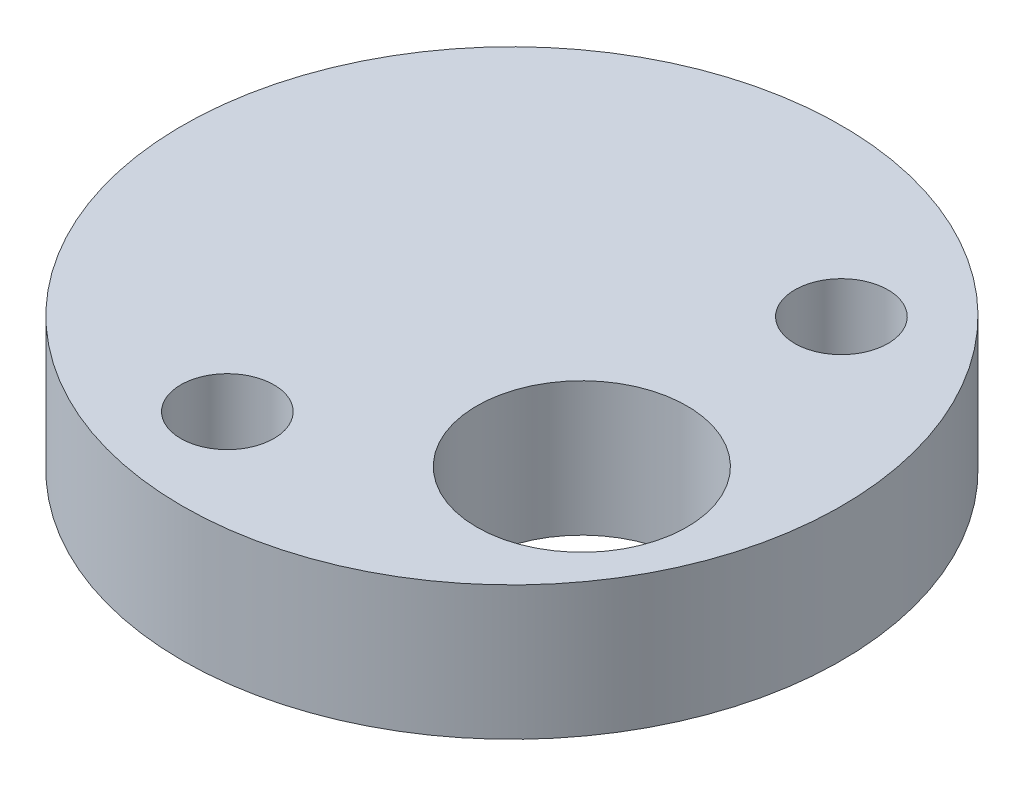
ISO-10303-21;
HEADER;
FILE_DESCRIPTION(('STEP AP214'),'2;1');
FILE_NAME('part.step','',(''),(''),'','','');
FILE_SCHEMA(('AUTOMOTIVE_DESIGN { 1 0 10303 214 1 1 1 1 }'));
ENDSEC;
DATA;
#1=APPLICATION_CONTEXT('core data for automotive mechanical design processes');
#2=APPLICATION_PROTOCOL_DEFINITION('international standard','automotive_design',2000,#1);
#3=PRODUCT_CONTEXT('',#1,'mechanical');
#4=PRODUCT('Part','Part','',(#3));
#5=PRODUCT_RELATED_PRODUCT_CATEGORY('part','',(#4));
#6=PRODUCT_DEFINITION_FORMATION('','',#4);
#7=PRODUCT_DEFINITION_CONTEXT('part definition',#1,'design');
#8=PRODUCT_DEFINITION('design','',#6,#7);
#9=PRODUCT_DEFINITION_SHAPE('','',#8);
#10=(LENGTH_UNIT() NAMED_UNIT(*) SI_UNIT(.MILLI.,.METRE.));
#11=(NAMED_UNIT(*) PLANE_ANGLE_UNIT() SI_UNIT($,.RADIAN.));
#12=(NAMED_UNIT(*) SI_UNIT($,.STERADIAN.) SOLID_ANGLE_UNIT());
#13=UNCERTAINTY_MEASURE_WITH_UNIT(LENGTH_MEASURE(1.E-05),#10,'distance_accuracy_value','');
#14=(GEOMETRIC_REPRESENTATION_CONTEXT(3) GLOBAL_UNCERTAINTY_ASSIGNED_CONTEXT((#13)) GLOBAL_UNIT_ASSIGNED_CONTEXT((#10,
#11,#12)) REPRESENTATION_CONTEXT('',''));
#15=CARTESIAN_POINT('',(0.,0.,0.));
#16=DIRECTION('',(0.,0.,1.));
#17=DIRECTION('',(1.,0.,0.));
#18=AXIS2_PLACEMENT_3D('',#15,#16,#17);
#19=CARTESIAN_POINT('',(-3.46410161513776,-5.6,-2.));
#20=DIRECTION('',(0.,1.,0.));
#21=DIRECTION('',(0.,0.,1.));
#22=AXIS2_PLACEMENT_3D('',#19,#20,#21);
#23=CYLINDRICAL_SURFACE('',#22,6.9);
#24=CARTESIAN_POINT('',(-3.46410161513776,-5.6,-2.));
#25=DIRECTION('',(0.,1.,0.));
#26=DIRECTION('',(0.,0.,1.));
#27=AXIS2_PLACEMENT_3D('',#24,#25,#26);
#28=CIRCLE('',#27,6.9);
#29=CARTESIAN_POINT('',(-3.46410161513776,-5.6,4.9));
#30=VERTEX_POINT('',#29);
#31=EDGE_CURVE('E10',#30,#30,#28,.T.);
#32=ORIENTED_EDGE('',*,*,#31,.T.);
#33=EDGE_LOOP('',(#32));
#34=FACE_BOUND('',#33,.T.);
#35=CARTESIAN_POINT('',(-3.46410161513776,-2.8,-2.));
#36=DIRECTION('',(0.,1.,0.));
#37=DIRECTION('',(0.,0.,1.));
#38=AXIS2_PLACEMENT_3D('',#35,#36,#37);
#39=CIRCLE('',#38,6.9);
#40=CARTESIAN_POINT('',(-3.46410161513776,-2.8,4.9));
#41=VERTEX_POINT('',#40);
#42=EDGE_CURVE('E42',#41,#41,#39,.T.);
#43=ORIENTED_EDGE('',*,*,#42,.F.);
#44=EDGE_LOOP('',(#43));
#45=FACE_BOUND('',#44,.T.);
#46=ADVANCED_FACE('F39',(#34,#45),#23,.T.);
#47=CARTESIAN_POINT('',(-3.46410161513776,-5.6,-2.));
#48=DIRECTION('',(0.,1.,0.));
#49=DIRECTION('',(0.,0.,1.));
#50=AXIS2_PLACEMENT_3D('',#47,#48,#49);
#51=PLANE('',#50);
#52=CARTESIAN_POINT('',(0.,-5.6,-5.43370574956714));
#53=DIRECTION('',(0.,1.,0.));
#54=DIRECTION('',(0.,0.,1.));
#55=AXIS2_PLACEMENT_3D('',#52,#53,#54);
#56=CIRCLE('',#55,0.975000000000001);
#57=CARTESIAN_POINT('',(0.,-5.6,-4.45870574956714));
#58=VERTEX_POINT('',#57);
#59=EDGE_CURVE('E60',#58,#58,#56,.T.);
#60=ORIENTED_EDGE('',*,*,#59,.T.);
#61=EDGE_LOOP('',(#60));
#62=FACE_BOUND('',#61,.T.);
#63=CARTESIAN_POINT('',(0.,-5.6,0.));
#64=DIRECTION('',(0.,1.,0.));
#65=DIRECTION('',(0.,0.,1.));
#66=AXIS2_PLACEMENT_3D('',#63,#64,#65);
#67=CIRCLE('',#66,2.2);
#68=CARTESIAN_POINT('',(0.,-5.6,2.2));
#69=VERTEX_POINT('',#68);
#70=EDGE_CURVE('E54',#69,#69,#67,.T.);
#71=ORIENTED_EDGE('',*,*,#70,.T.);
#72=EDGE_LOOP('',(#71));
#73=FACE_BOUND('',#72,.T.);
#74=CARTESIAN_POINT('',(-4.70572721581471,-5.6,2.71685287478357));
#75=DIRECTION('',(0.,1.,0.));
#76=DIRECTION('',(0.,0.,1.));
#77=AXIS2_PLACEMENT_3D('',#74,#75,#76);
#78=CIRCLE('',#77,0.975);
#79=CARTESIAN_POINT('',(-4.70572721581471,-5.6,3.69185287478357));
#80=VERTEX_POINT('',#79);
#81=EDGE_CURVE('E49',#80,#80,#78,.T.);
#82=ORIENTED_EDGE('',*,*,#81,.T.);
#83=EDGE_LOOP('',(#82));
#84=FACE_BOUND('',#83,.T.);
#85=ORIENTED_EDGE('',*,*,#31,.F.);
#86=EDGE_LOOP('',(#85));
#87=FACE_BOUND('',#86,.T.);
#88=ADVANCED_FACE('F69',(#62,#73,#84,#87),#51,.F.);
#89=CARTESIAN_POINT('',(-3.46410161513776,-2.8,-2.));
#90=DIRECTION('',(0.,1.,0.));
#91=DIRECTION('',(0.,0.,1.));
#92=AXIS2_PLACEMENT_3D('',#89,#90,#91);
#93=PLANE('',#92);
#94=CARTESIAN_POINT('',(0.,-2.8,-5.43370574956714));
#95=DIRECTION('',(0.,1.,0.));
#96=DIRECTION('',(0.,0.,1.));
#97=AXIS2_PLACEMENT_3D('',#94,#95,#96);
#98=CIRCLE('',#97,0.975000000000001);
#99=CARTESIAN_POINT('',(0.,-2.8,-4.45870574956714));
#100=VERTEX_POINT('',#99);
#101=EDGE_CURVE('E63',#100,#100,#98,.T.);
#102=ORIENTED_EDGE('',*,*,#101,.F.);
#103=EDGE_LOOP('',(#102));
#104=FACE_BOUND('',#103,.T.);
#105=CARTESIAN_POINT('',(0.,-2.8,0.));
#106=DIRECTION('',(0.,1.,0.));
#107=DIRECTION('',(0.,0.,1.));
#108=AXIS2_PLACEMENT_3D('',#105,#106,#107);
#109=CIRCLE('',#108,2.2);
#110=CARTESIAN_POINT('',(0.,-2.8,2.2));
#111=VERTEX_POINT('',#110);
#112=EDGE_CURVE('E57',#111,#111,#109,.T.);
#113=ORIENTED_EDGE('',*,*,#112,.F.);
#114=EDGE_LOOP('',(#113));
#115=FACE_BOUND('',#114,.T.);
#116=CARTESIAN_POINT('',(-4.70572721581471,-2.8,2.71685287478357));
#117=DIRECTION('',(0.,1.,0.));
#118=DIRECTION('',(0.,0.,1.));
#119=AXIS2_PLACEMENT_3D('',#116,#117,#118);
#120=CIRCLE('',#119,0.975);
#121=CARTESIAN_POINT('',(-4.70572721581471,-2.8,3.69185287478357));
#122=VERTEX_POINT('',#121);
#123=EDGE_CURVE('E51',#122,#122,#120,.T.);
#124=ORIENTED_EDGE('',*,*,#123,.F.);
#125=EDGE_LOOP('',(#124));
#126=FACE_BOUND('',#125,.T.);
#127=ORIENTED_EDGE('',*,*,#42,.T.);
#128=EDGE_LOOP('',(#127));
#129=FACE_BOUND('',#128,.T.);
#130=ADVANCED_FACE('F79',(#104,#115,#126,#129),#93,.T.);
#131=CARTESIAN_POINT('',(-4.70572721581471,-5.6,2.71685287478357));
#132=DIRECTION('',(0.,1.,0.));
#133=DIRECTION('',(0.,0.,1.));
#134=AXIS2_PLACEMENT_3D('',#131,#132,#133);
#135=CYLINDRICAL_SURFACE('',#134,0.975);
#136=ORIENTED_EDGE('',*,*,#81,.F.);
#137=EDGE_LOOP('',(#136));
#138=FACE_BOUND('',#137,.T.);
#139=ORIENTED_EDGE('',*,*,#123,.T.);
#140=EDGE_LOOP('',(#139));
#141=FACE_BOUND('',#140,.T.);
#142=ADVANCED_FACE('F82',(#138,#141),#135,.F.);
#143=CARTESIAN_POINT('',(0.,-5.6,0.));
#144=DIRECTION('',(0.,1.,0.));
#145=DIRECTION('',(0.,0.,1.));
#146=AXIS2_PLACEMENT_3D('',#143,#144,#145);
#147=CYLINDRICAL_SURFACE('',#146,2.2);
#148=ORIENTED_EDGE('',*,*,#70,.F.);
#149=EDGE_LOOP('',(#148));
#150=FACE_BOUND('',#149,.T.);
#151=ORIENTED_EDGE('',*,*,#112,.T.);
#152=EDGE_LOOP('',(#151));
#153=FACE_BOUND('',#152,.T.);
#154=ADVANCED_FACE('F75',(#150,#153),#147,.F.);
#155=CARTESIAN_POINT('',(0.,-5.6,-5.43370574956714));
#156=DIRECTION('',(0.,1.,0.));
#157=DIRECTION('',(0.,0.,1.));
#158=AXIS2_PLACEMENT_3D('',#155,#156,#157);
#159=CYLINDRICAL_SURFACE('',#158,0.975000000000001);
#160=ORIENTED_EDGE('',*,*,#59,.F.);
#161=EDGE_LOOP('',(#160));
#162=FACE_BOUND('',#161,.T.);
#163=ORIENTED_EDGE('',*,*,#101,.T.);
#164=EDGE_LOOP('',(#163));
#165=FACE_BOUND('',#164,.T.);
#166=ADVANCED_FACE('F72',(#162,#165),#159,.F.);
#167=CLOSED_SHELL('',(#46,#88,#130,#142,#154,#166));
#168=MANIFOLD_SOLID_BREP('B2',#167);
#169=ADVANCED_BREP_SHAPE_REPRESENTATION('',(#18,#168),#14);
#170=SHAPE_DEFINITION_REPRESENTATION(#9,#169);
ENDSEC;
END-ISO-10303-21;
